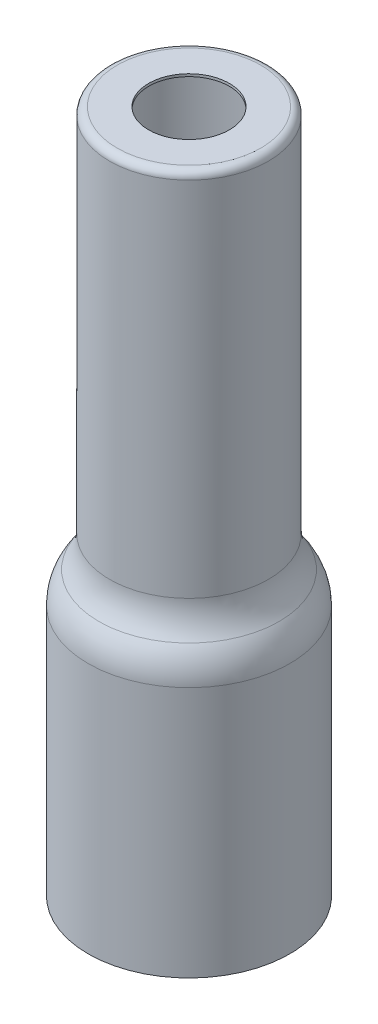
ISO-10303-21;
HEADER;
FILE_DESCRIPTION(('STEP AP214'),'2;1');
FILE_NAME('part.step','',(''),(''),'','','');
FILE_SCHEMA(('AUTOMOTIVE_DESIGN { 1 0 10303 214 1 1 1 1 }'));
ENDSEC;
DATA;
#1=APPLICATION_CONTEXT('core data for automotive mechanical design processes');
#2=APPLICATION_PROTOCOL_DEFINITION('international standard','automotive_design',2000,#1);
#3=PRODUCT_CONTEXT('',#1,'mechanical');
#4=PRODUCT('Part','Part','',(#3));
#5=PRODUCT_RELATED_PRODUCT_CATEGORY('part','',(#4));
#6=PRODUCT_DEFINITION_FORMATION('','',#4);
#7=PRODUCT_DEFINITION_CONTEXT('part definition',#1,'design');
#8=PRODUCT_DEFINITION('design','',#6,#7);
#9=PRODUCT_DEFINITION_SHAPE('','',#8);
#10=(LENGTH_UNIT() NAMED_UNIT(*) SI_UNIT(.MILLI.,.METRE.));
#11=(NAMED_UNIT(*) PLANE_ANGLE_UNIT() SI_UNIT($,.RADIAN.));
#12=(NAMED_UNIT(*) SI_UNIT($,.STERADIAN.) SOLID_ANGLE_UNIT());
#13=UNCERTAINTY_MEASURE_WITH_UNIT(LENGTH_MEASURE(1.E-05),#10,'distance_accuracy_value','');
#14=(GEOMETRIC_REPRESENTATION_CONTEXT(3) GLOBAL_UNCERTAINTY_ASSIGNED_CONTEXT((#13)) GLOBAL_UNIT_ASSIGNED_CONTEXT((#10,
#11,#12)) REPRESENTATION_CONTEXT('',''));
#15=CARTESIAN_POINT('',(0.,0.,0.));
#16=DIRECTION('',(0.,0.,1.));
#17=DIRECTION('',(1.,0.,0.));
#18=AXIS2_PLACEMENT_3D('',#15,#16,#17);
#19=CARTESIAN_POINT('',(0.,0.,0.));
#20=DIRECTION('',(0.,1.,0.));
#21=DIRECTION('',(0.,0.,1.));
#22=AXIS2_PLACEMENT_3D('',#19,#20,#21);
#23=PLANE('',#22);
#24=CARTESIAN_POINT('',(0.,0.,0.));
#25=DIRECTION('',(0.,1.,0.));
#26=DIRECTION('',(0.,0.,1.));
#27=AXIS2_PLACEMENT_3D('',#24,#25,#26);
#28=CIRCLE('',#27,40.);
#29=CARTESIAN_POINT('',(0.,0.,40.));
#30=VERTEX_POINT('',#29);
#31=EDGE_CURVE('E55',#30,#30,#28,.T.);
#32=ORIENTED_EDGE('',*,*,#31,.F.);
#33=EDGE_LOOP('',(#32));
#34=FACE_BOUND('',#33,.T.);
#35=CARTESIAN_POINT('',(0.,0.,0.));
#36=DIRECTION('',(0.,1.,0.));
#37=DIRECTION('',(0.,0.,1.));
#38=AXIS2_PLACEMENT_3D('',#35,#36,#37);
#39=CIRCLE('',#38,30.);
#40=CARTESIAN_POINT('',(0.,0.,30.));
#41=VERTEX_POINT('',#40);
#42=EDGE_CURVE('E58',#41,#41,#39,.T.);
#43=ORIENTED_EDGE('',*,*,#42,.T.);
#44=EDGE_LOOP('',(#43));
#45=FACE_BOUND('',#44,.T.);
#46=ADVANCED_FACE('F29',(#34,#45),#23,.F.);
#47=CARTESIAN_POINT('',(0.,43.,0.));
#48=DIRECTION('',(0.,-1.,0.));
#49=DIRECTION('',(0.,0.,-1.));
#50=AXIS2_PLACEMENT_3D('',#47,#48,#49);
#51=CYLINDRICAL_SURFACE('',#50,40.);
#52=CARTESIAN_POINT('',(0.,99.7104821007115,0.));
#53=DIRECTION('',(0.,-1.,0.));
#54=DIRECTION('',(0.,0.,-1.));
#55=AXIS2_PLACEMENT_3D('',#52,#53,#54);
#56=CIRCLE('',#55,40.);
#57=CARTESIAN_POINT('',(0.,99.7104821007115,-40.));
#58=VERTEX_POINT('',#57);
#59=EDGE_CURVE('E40',#58,#58,#56,.T.);
#60=ORIENTED_EDGE('',*,*,#59,.T.);
#61=EDGE_LOOP('',(#60));
#62=FACE_BOUND('',#61,.T.);
#63=ORIENTED_EDGE('',*,*,#31,.T.);
#64=EDGE_LOOP('',(#63));
#65=FACE_BOUND('',#64,.T.);
#66=ADVANCED_FACE('F92',(#62,#65),#51,.T.);
#67=CARTESIAN_POINT('',(0.,43.,0.));
#68=DIRECTION('',(0.,-1.,0.));
#69=DIRECTION('',(0.,0.,-1.));
#70=AXIS2_PLACEMENT_3D('',#67,#68,#69);
#71=CYLINDRICAL_SURFACE('',#70,30.);
#72=CARTESIAN_POINT('',(0.,43.,0.));
#73=DIRECTION('',(0.,1.,0.));
#74=DIRECTION('',(0.,0.,1.));
#75=AXIS2_PLACEMENT_3D('',#72,#73,#74);
#76=CIRCLE('',#75,30.);
#77=CARTESIAN_POINT('',(0.,43.,30.));
#78=VERTEX_POINT('',#77);
#79=EDGE_CURVE('E61',#78,#78,#76,.T.);
#80=ORIENTED_EDGE('',*,*,#79,.T.);
#81=EDGE_LOOP('',(#80));
#82=FACE_BOUND('',#81,.T.);
#83=ORIENTED_EDGE('',*,*,#42,.F.);
#84=EDGE_LOOP('',(#83));
#85=FACE_BOUND('',#84,.T.);
#86=ADVANCED_FACE('F98',(#82,#85),#71,.F.);
#87=CARTESIAN_POINT('',(0.,43.,0.));
#88=DIRECTION('',(0.,1.,0.));
#89=DIRECTION('',(0.,0.,1.));
#90=AXIS2_PLACEMENT_3D('',#87,#88,#89);
#91=PLANE('',#90);
#92=ORIENTED_EDGE('',*,*,#79,.F.);
#93=EDGE_LOOP('',(#92));
#94=FACE_BOUND('',#93,.T.);
#95=ADVANCED_FACE('F112',(#94),#91,.F.);
#96=CARTESIAN_POINT('',(0.,270.,0.));
#97=DIRECTION('',(0.,-1.,0.));
#98=DIRECTION('',(0.,0.,-1.));
#99=AXIS2_PLACEMENT_3D('',#96,#97,#98);
#100=CYLINDRICAL_SURFACE('',#99,31.5);
#101=CARTESIAN_POINT('',(0.,268.,0.));
#102=DIRECTION('',(0.,1.,0.));
#103=DIRECTION('',(0.,0.,1.));
#104=AXIS2_PLACEMENT_3D('',#101,#102,#103);
#105=CIRCLE('',#104,31.5);
#106=CARTESIAN_POINT('',(0.,268.,31.5));
#107=VERTEX_POINT('',#106);
#108=EDGE_CURVE('E10',#107,#107,#105,.F.);
#109=ORIENTED_EDGE('',*,*,#108,.T.);
#110=EDGE_LOOP('',(#109));
#111=FACE_BOUND('',#110,.T.);
#112=CARTESIAN_POINT('',(0.,124.363068171954,0.));
#113=DIRECTION('',(0.,-1.,0.));
#114=DIRECTION('',(0.,0.,-1.));
#115=AXIS2_PLACEMENT_3D('',#112,#113,#114);
#116=CIRCLE('',#115,31.5);
#117=CARTESIAN_POINT('',(0.,124.363068171954,-31.5));
#118=VERTEX_POINT('',#117);
#119=EDGE_CURVE('E49',#118,#118,#116,.F.);
#120=ORIENTED_EDGE('',*,*,#119,.T.);
#121=EDGE_LOOP('',(#120));
#122=FACE_BOUND('',#121,.T.);
#123=ADVANCED_FACE('F107',(#111,#122),#100,.T.);
#124=CARTESIAN_POINT('',(0.,124.363068171954,0.));
#125=DIRECTION('',(0.,-1.,0.));
#126=DIRECTION('',(0.,0.,-1.));
#127=AXIS2_PLACEMENT_3D('',#124,#125,#126);
#128=TOROIDAL_SURFACE('',#127,51.5,20.);
#129=CARTESIAN_POINT('',(0.,112.036775136333,0.));
#130=DIRECTION('',(0.,1.,0.));
#131=DIRECTION('',(0.,0.,1.));
#132=AXIS2_PLACEMENT_3D('',#129,#130,#131);
#133=CIRCLE('',#132,35.75);
#134=CARTESIAN_POINT('',(0.,112.036775136333,35.75));
#135=VERTEX_POINT('',#134);
#136=EDGE_CURVE('E44',#135,#135,#133,.T.);
#137=ORIENTED_EDGE('',*,*,#136,.T.);
#138=EDGE_LOOP('',(#137));
#139=FACE_BOUND('',#138,.T.);
#140=ORIENTED_EDGE('',*,*,#119,.F.);
#141=EDGE_LOOP('',(#140));
#142=FACE_BOUND('',#141,.T.);
#143=ADVANCED_FACE('F88',(#139,#142),#128,.F.);
#144=CARTESIAN_POINT('',(0.,99.7104821007115,0.));
#145=DIRECTION('',(0.,-1.,0.));
#146=DIRECTION('',(0.,0.,-1.));
#147=AXIS2_PLACEMENT_3D('',#144,#145,#146);
#148=DEGENERATE_TOROIDAL_SURFACE('',#147,20.,20.,.T.);
#149=ORIENTED_EDGE('',*,*,#59,.F.);
#150=EDGE_LOOP('',(#149));
#151=FACE_BOUND('',#150,.T.);
#152=ORIENTED_EDGE('',*,*,#136,.F.);
#153=EDGE_LOOP('',(#152));
#154=FACE_BOUND('',#153,.T.);
#155=ADVANCED_FACE('F80',(#151,#154),#148,.T.);
#156=CARTESIAN_POINT('',(0.,271.,0.));
#157=DIRECTION('',(0.,1.,0.));
#158=DIRECTION('',(0.,0.,1.));
#159=AXIS2_PLACEMENT_3D('',#156,#157,#158);
#160=PLANE('',#159);
#161=CARTESIAN_POINT('',(0.,271.,0.));
#162=DIRECTION('',(0.,1.,0.));
#163=DIRECTION('',(0.,0.,1.));
#164=AXIS2_PLACEMENT_3D('',#161,#162,#163);
#165=CIRCLE('',#164,28.5);
#166=CARTESIAN_POINT('',(0.,271.,28.5));
#167=VERTEX_POINT('',#166);
#168=EDGE_CURVE('E36',#167,#167,#165,.T.);
#169=ORIENTED_EDGE('',*,*,#168,.T.);
#170=EDGE_LOOP('',(#169));
#171=FACE_BOUND('',#170,.T.);
#172=CARTESIAN_POINT('',(0.,271.,0.));
#173=DIRECTION('',(0.,1.,0.));
#174=DIRECTION('',(0.,0.,1.));
#175=AXIS2_PLACEMENT_3D('',#172,#173,#174);
#176=CIRCLE('',#175,16.);
#177=CARTESIAN_POINT('',(0.,271.,16.));
#178=VERTEX_POINT('',#177);
#179=EDGE_CURVE('E67',#178,#178,#176,.T.);
#180=ORIENTED_EDGE('',*,*,#179,.F.);
#181=EDGE_LOOP('',(#180));
#182=FACE_BOUND('',#181,.T.);
#183=ADVANCED_FACE('F77',(#171,#182),#160,.T.);
#184=CARTESIAN_POINT('',(0.,270.,0.));
#185=DIRECTION('',(0.,1.,0.));
#186=DIRECTION('',(0.,0.,1.));
#187=AXIS2_PLACEMENT_3D('',#184,#185,#186);
#188=PLANE('',#187);
#189=CARTESIAN_POINT('',(0.,270.,0.));
#190=DIRECTION('',(0.,1.,0.));
#191=DIRECTION('',(0.,0.,1.));
#192=AXIS2_PLACEMENT_3D('',#189,#190,#191);
#193=CIRCLE('',#192,30.5);
#194=CARTESIAN_POINT('',(0.,270.,30.5));
#195=VERTEX_POINT('',#194);
#196=EDGE_CURVE('E64',#195,#195,#193,.T.);
#197=ORIENTED_EDGE('',*,*,#196,.F.);
#198=EDGE_LOOP('',(#197));
#199=FACE_BOUND('',#198,.T.);
#200=CARTESIAN_POINT('',(0.,270.,0.));
#201=DIRECTION('',(0.,1.,0.));
#202=DIRECTION('',(0.,0.,1.));
#203=AXIS2_PLACEMENT_3D('',#200,#201,#202);
#204=CIRCLE('',#203,16.);
#205=CARTESIAN_POINT('',(0.,270.,16.));
#206=VERTEX_POINT('',#205);
#207=EDGE_CURVE('E68',#206,#206,#204,.T.);
#208=ORIENTED_EDGE('',*,*,#207,.T.);
#209=EDGE_LOOP('',(#208));
#210=FACE_BOUND('',#209,.T.);
#211=ADVANCED_FACE('F79',(#199,#210),#188,.F.);
#212=CARTESIAN_POINT('',(0.,271.,0.));
#213=DIRECTION('',(0.,-1.,0.));
#214=DIRECTION('',(0.,0.,-1.));
#215=AXIS2_PLACEMENT_3D('',#212,#213,#214);
#216=CYLINDRICAL_SURFACE('',#215,16.);
#217=ORIENTED_EDGE('',*,*,#179,.T.);
#218=EDGE_LOOP('',(#217));
#219=FACE_BOUND('',#218,.T.);
#220=ORIENTED_EDGE('',*,*,#207,.F.);
#221=EDGE_LOOP('',(#220));
#222=FACE_BOUND('',#221,.T.);
#223=ADVANCED_FACE('F74',(#219,#222),#216,.F.);
#224=CARTESIAN_POINT('',(0.,108.,0.));
#225=DIRECTION('',(0.,1.,0.));
#226=DIRECTION('',(0.,0.,1.));
#227=AXIS2_PLACEMENT_3D('',#224,#225,#226);
#228=PLANE('',#227);
#229=CARTESIAN_POINT('',(0.,108.,0.));
#230=DIRECTION('',(0.,1.,0.));
#231=DIRECTION('',(0.,0.,1.));
#232=AXIS2_PLACEMENT_3D('',#229,#230,#231);
#233=CIRCLE('',#232,30.5);
#234=CARTESIAN_POINT('',(0.,108.,30.5));
#235=VERTEX_POINT('',#234);
#236=EDGE_CURVE('E52',#235,#235,#233,.F.);
#237=ORIENTED_EDGE('',*,*,#236,.F.);
#238=EDGE_LOOP('',(#237));
#239=FACE_BOUND('',#238,.T.);
#240=ADVANCED_FACE('F126',(#239),#228,.T.);
#241=CARTESIAN_POINT('',(0.,270.,0.));
#242=DIRECTION('',(0.,-1.,0.));
#243=DIRECTION('',(0.,0.,-1.));
#244=AXIS2_PLACEMENT_3D('',#241,#242,#243);
#245=CYLINDRICAL_SURFACE('',#244,30.5);
#246=ORIENTED_EDGE('',*,*,#196,.T.);
#247=EDGE_LOOP('',(#246));
#248=FACE_BOUND('',#247,.T.);
#249=ORIENTED_EDGE('',*,*,#236,.T.);
#250=EDGE_LOOP('',(#249));
#251=FACE_BOUND('',#250,.T.);
#252=ADVANCED_FACE('F125',(#248,#251),#245,.F.);
#253=CARTESIAN_POINT('',(0.,268.,0.));
#254=DIRECTION('',(0.,1.,0.));
#255=DIRECTION('',(0.,0.,1.));
#256=AXIS2_PLACEMENT_3D('',#253,#254,#255);
#257=TOROIDAL_SURFACE('',#256,28.5,3.);
#258=ORIENTED_EDGE('',*,*,#108,.F.);
#259=EDGE_LOOP('',(#258));
#260=FACE_BOUND('',#259,.T.);
#261=ORIENTED_EDGE('',*,*,#168,.F.);
#262=EDGE_LOOP('',(#261));
#263=FACE_BOUND('',#262,.T.);
#264=ADVANCED_FACE('F31',(#260,#263),#257,.T.);
#265=CLOSED_SHELL('',(#46,#66,#86,#95,#123,#143,#155,#183,#211,#223,#240,#252,#264));
#266=MANIFOLD_SOLID_BREP('B2',#265);
#267=ADVANCED_BREP_SHAPE_REPRESENTATION('',(#18,#266),#14);
#268=SHAPE_DEFINITION_REPRESENTATION(#9,#267);
ENDSEC;
END-ISO-10303-21;
